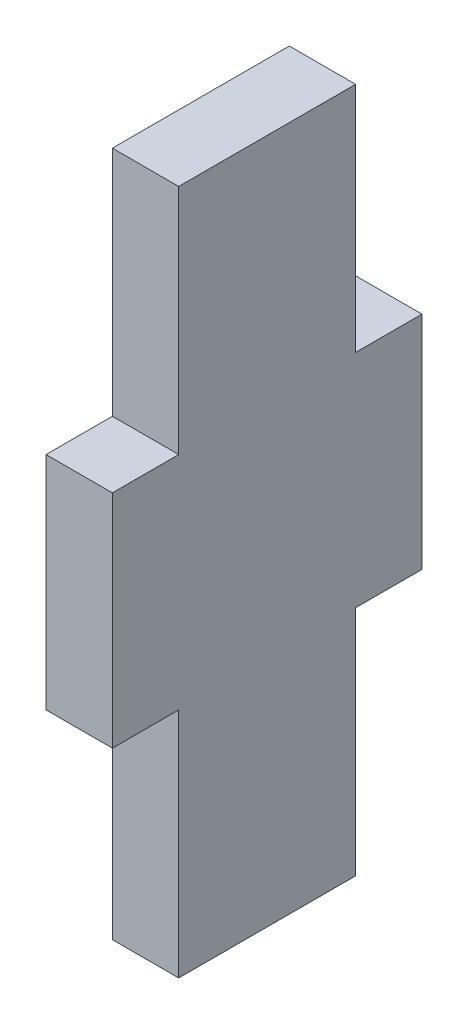
ISO-10303-21;
HEADER;
FILE_DESCRIPTION(('STEP AP214'),'2;1');
FILE_NAME('part.step','',(''),(''),'','','');
FILE_SCHEMA(('AUTOMOTIVE_DESIGN { 1 0 10303 214 1 1 1 1 }'));
ENDSEC;
DATA;
#1=APPLICATION_CONTEXT('core data for automotive mechanical design processes');
#2=APPLICATION_PROTOCOL_DEFINITION('international standard','automotive_design',2000,#1);
#3=PRODUCT_CONTEXT('',#1,'mechanical');
#4=PRODUCT('Part','Part','',(#3));
#5=PRODUCT_RELATED_PRODUCT_CATEGORY('part','',(#4));
#6=PRODUCT_DEFINITION_FORMATION('','',#4);
#7=PRODUCT_DEFINITION_CONTEXT('part definition',#1,'design');
#8=PRODUCT_DEFINITION('design','',#6,#7);
#9=PRODUCT_DEFINITION_SHAPE('','',#8);
#10=(LENGTH_UNIT() NAMED_UNIT(*) SI_UNIT(.MILLI.,.METRE.));
#11=(NAMED_UNIT(*) PLANE_ANGLE_UNIT() SI_UNIT($,.RADIAN.));
#12=(NAMED_UNIT(*) SI_UNIT($,.STERADIAN.) SOLID_ANGLE_UNIT());
#13=UNCERTAINTY_MEASURE_WITH_UNIT(LENGTH_MEASURE(1.E-05),#10,'distance_accuracy_value','');
#14=(GEOMETRIC_REPRESENTATION_CONTEXT(3) GLOBAL_UNCERTAINTY_ASSIGNED_CONTEXT((#13)) GLOBAL_UNIT_ASSIGNED_CONTEXT((#10,
#11,#12)) REPRESENTATION_CONTEXT('',''));
#15=CARTESIAN_POINT('',(0.,0.,0.));
#16=DIRECTION('',(0.,0.,1.));
#17=DIRECTION('',(1.,0.,0.));
#18=AXIS2_PLACEMENT_3D('',#15,#16,#17);
#19=CARTESIAN_POINT('',(-103.003078089394,28.2958445793191,184.000049999986));
#20=DIRECTION('',(0.,0.,1.));
#21=DIRECTION('',(1.,0.,0.));
#22=AXIS2_PLACEMENT_3D('',#19,#20,#21);
#23=PLANE('',#22);
#24=DIRECTION('',(1.,0.,0.));
#25=VECTOR('',#24,1.);
#26=CARTESIAN_POINT('',(-103.003078089394,7.29584457931905,184.000049999986));
#27=LINE('',#26,#25);
#28=CARTESIAN_POINT('',(-103.003078089394,7.29584457931905,184.000049999986));
#29=VERTEX_POINT('',#28);
#30=CARTESIAN_POINT('',(-97.0030780893944,7.29584457931905,184.000049999986));
#31=VERTEX_POINT('',#30);
#32=EDGE_CURVE('E133',#29,#31,#27,.T.);
#33=ORIENTED_EDGE('',*,*,#32,.F.);
#34=DIRECTION('',(0.,-1.,0.));
#35=VECTOR('',#34,1.);
#36=CARTESIAN_POINT('',(-103.003078089394,28.2958445793191,184.000049999986));
#37=LINE('',#36,#35);
#38=CARTESIAN_POINT('',(-103.003078089394,28.2958445793191,184.000049999986));
#39=VERTEX_POINT('',#38);
#40=EDGE_CURVE('E145',#39,#29,#37,.T.);
#41=ORIENTED_EDGE('',*,*,#40,.F.);
#42=DIRECTION('',(1.,0.,0.));
#43=VECTOR('',#42,1.);
#44=CARTESIAN_POINT('',(-103.003078089394,28.2958445793191,184.000049999986));
#45=LINE('',#44,#43);
#46=CARTESIAN_POINT('',(-97.0030780893944,28.2958445793191,184.000049999986));
#47=VERTEX_POINT('',#46);
#48=EDGE_CURVE('E44',#39,#47,#45,.T.);
#49=ORIENTED_EDGE('',*,*,#48,.T.);
#50=DIRECTION('',(0.,-1.,0.));
#51=VECTOR('',#50,1.);
#52=CARTESIAN_POINT('',(-97.0030780893944,28.2958445793191,184.000049999986));
#53=LINE('',#52,#51);
#54=EDGE_CURVE('E147',#47,#31,#53,.T.);
#55=ORIENTED_EDGE('',*,*,#54,.T.);
#56=EDGE_LOOP('',(#33,#41,#49,#55));
#57=FACE_BOUND('',#56,.T.);
#58=ADVANCED_FACE('F35',(#57),#23,.F.);
#59=CARTESIAN_POINT('',(-103.003078089394,22.2958445793191,200.000049999986));
#60=DIRECTION('',(0.,0.,-1.));
#61=DIRECTION('',(-1.,0.,0.));
#62=AXIS2_PLACEMENT_3D('',#59,#60,#61);
#63=PLANE('',#62);
#64=DIRECTION('',(1.,0.,0.));
#65=VECTOR('',#64,1.);
#66=CARTESIAN_POINT('',(-103.003078089394,-12.7041554206809,200.000049999986));
#67=LINE('',#66,#65);
#68=CARTESIAN_POINT('',(-103.003078089394,-12.7041554206809,200.000049999986));
#69=VERTEX_POINT('',#68);
#70=CARTESIAN_POINT('',(-97.0030780893944,-12.7041554206809,200.000049999986));
#71=VERTEX_POINT('',#70);
#72=EDGE_CURVE('E190',#69,#71,#67,.T.);
#73=ORIENTED_EDGE('',*,*,#72,.F.);
#74=DIRECTION('',(0.,1.,0.));
#75=VECTOR('',#74,1.);
#76=CARTESIAN_POINT('',(-103.003078089394,22.2958445793191,200.000049999986));
#77=LINE('',#76,#75);
#78=CARTESIAN_POINT('',(-103.003078089394,-33.7041554206809,200.000049999986));
#79=VERTEX_POINT('',#78);
#80=EDGE_CURVE('E204',#79,#69,#77,.T.);
#81=ORIENTED_EDGE('',*,*,#80,.F.);
#82=DIRECTION('',(1.,0.,0.));
#83=VECTOR('',#82,1.);
#84=CARTESIAN_POINT('',(-103.003078089394,-33.7041554206809,200.000049999986));
#85=LINE('',#84,#83);
#86=CARTESIAN_POINT('',(-97.0030780893944,-33.7041554206809,200.000049999986));
#87=VERTEX_POINT('',#86);
#88=EDGE_CURVE('E189',#79,#87,#85,.T.);
#89=ORIENTED_EDGE('',*,*,#88,.T.);
#90=DIRECTION('',(0.,1.,0.));
#91=VECTOR('',#90,1.);
#92=CARTESIAN_POINT('',(-97.0030780893944,22.2958445793191,200.000049999986));
#93=LINE('',#92,#91);
#94=EDGE_CURVE('E178',#87,#71,#93,.T.);
#95=ORIENTED_EDGE('',*,*,#94,.T.);
#96=EDGE_LOOP('',(#73,#81,#89,#95));
#97=FACE_BOUND('',#96,.T.);
#98=ADVANCED_FACE('F272',(#97),#63,.F.);
#99=CARTESIAN_POINT('',(-103.003078089394,7.29584457931905,200.000049999986));
#100=VERTEX_POINT('',#99);
#101=CARTESIAN_POINT('',(-103.003078089394,28.2958445793191,200.000049999986));
#102=VERTEX_POINT('',#101);
#103=EDGE_CURVE('E183',#100,#102,#77,.T.);
#104=ORIENTED_EDGE('',*,*,#103,.F.);
#105=DIRECTION('',(1.,0.,0.));
#106=VECTOR('',#105,1.);
#107=CARTESIAN_POINT('',(-103.003078089394,7.29584457931905,200.000049999986));
#108=LINE('',#107,#106);
#109=CARTESIAN_POINT('',(-97.0030780893944,7.29584457931905,200.000049999986));
#110=VERTEX_POINT('',#109);
#111=EDGE_CURVE('E215',#100,#110,#108,.T.);
#112=ORIENTED_EDGE('',*,*,#111,.T.);
#113=CARTESIAN_POINT('',(-97.0030780893944,28.2958445793191,200.000049999986));
#114=VERTEX_POINT('',#113);
#115=EDGE_CURVE('E175',#110,#114,#93,.T.);
#116=ORIENTED_EDGE('',*,*,#115,.T.);
#117=DIRECTION('',(1.,0.,0.));
#118=VECTOR('',#117,1.);
#119=CARTESIAN_POINT('',(-103.003078089394,28.2958445793191,200.000049999986));
#120=LINE('',#119,#118);
#121=EDGE_CURVE('E11',#102,#114,#120,.T.);
#122=ORIENTED_EDGE('',*,*,#121,.F.);
#123=EDGE_LOOP('',(#104,#112,#116,#122));
#124=FACE_BOUND('',#123,.T.);
#125=ADVANCED_FACE('F37',(#124),#63,.F.);
#126=CARTESIAN_POINT('',(-103.003078089394,28.2958445793191,200.000049999986));
#127=DIRECTION('',(0.,-1.,0.));
#128=DIRECTION('',(0.,0.,-1.));
#129=AXIS2_PLACEMENT_3D('',#126,#127,#128);
#130=PLANE('',#129);
#131=DIRECTION('',(0.,0.,-1.));
#132=VECTOR('',#131,1.);
#133=CARTESIAN_POINT('',(-97.0030780893944,28.2958445793191,200.000049999986));
#134=LINE('',#133,#132);
#135=EDGE_CURVE('E172',#114,#47,#134,.T.);
#136=ORIENTED_EDGE('',*,*,#135,.T.);
#137=ORIENTED_EDGE('',*,*,#48,.F.);
#138=DIRECTION('',(0.,0.,-1.));
#139=VECTOR('',#138,1.);
#140=CARTESIAN_POINT('',(-103.003078089394,28.2958445793191,200.000049999986));
#141=LINE('',#140,#139);
#142=EDGE_CURVE('E153',#102,#39,#141,.T.);
#143=ORIENTED_EDGE('',*,*,#142,.F.);
#144=ORIENTED_EDGE('',*,*,#121,.T.);
#145=EDGE_LOOP('',(#136,#137,#143,#144));
#146=FACE_BOUND('',#145,.T.);
#147=ADVANCED_FACE('F212',(#146),#130,.F.);
#148=CARTESIAN_POINT('',(-103.003078089394,-12.7041554206809,184.000049999986));
#149=VERTEX_POINT('',#148);
#150=CARTESIAN_POINT('',(-103.003078089394,-33.7041554206809,184.000049999986));
#151=VERTEX_POINT('',#150);
#152=EDGE_CURVE('E155',#149,#151,#37,.T.);
#153=ORIENTED_EDGE('',*,*,#152,.F.);
#154=DIRECTION('',(1.,0.,0.));
#155=VECTOR('',#154,1.);
#156=CARTESIAN_POINT('',(-103.003078089394,-12.7041554206809,184.000049999986));
#157=LINE('',#156,#155);
#158=CARTESIAN_POINT('',(-97.0030780893944,-12.7041554206809,184.000049999986));
#159=VERTEX_POINT('',#158);
#160=EDGE_CURVE('E226',#149,#159,#157,.T.);
#161=ORIENTED_EDGE('',*,*,#160,.T.);
#162=CARTESIAN_POINT('',(-97.0030780893944,-33.7041554206809,184.000049999986));
#163=VERTEX_POINT('',#162);
#164=EDGE_CURVE('E161',#159,#163,#53,.T.);
#165=ORIENTED_EDGE('',*,*,#164,.T.);
#166=DIRECTION('',(1.,0.,0.));
#167=VECTOR('',#166,1.);
#168=CARTESIAN_POINT('',(-103.003078089394,-33.7041554206809,184.000049999986));
#169=LINE('',#168,#167);
#170=EDGE_CURVE('E224',#151,#163,#169,.T.);
#171=ORIENTED_EDGE('',*,*,#170,.F.);
#172=EDGE_LOOP('',(#153,#161,#165,#171));
#173=FACE_BOUND('',#172,.T.);
#174=ADVANCED_FACE('F223',(#173),#23,.F.);
#175=CARTESIAN_POINT('',(-103.003078089394,0.,0.));
#176=DIRECTION('',(-1.,0.,0.));
#177=DIRECTION('',(0.,0.,1.));
#178=AXIS2_PLACEMENT_3D('',#175,#176,#177);
#179=PLANE('',#178);
#180=ORIENTED_EDGE('',*,*,#80,.T.);
#181=DIRECTION('',(0.,0.,1.));
#182=VECTOR('',#181,1.);
#183=CARTESIAN_POINT('',(-103.003078089394,-12.7041554206809,200.000049999986));
#184=LINE('',#183,#182);
#185=CARTESIAN_POINT('',(-103.003078089394,-12.7041554206809,206.000049999986));
#186=VERTEX_POINT('',#185);
#187=EDGE_CURVE('E242',#69,#186,#184,.T.);
#188=ORIENTED_EDGE('',*,*,#187,.T.);
#189=DIRECTION('',(0.,1.,0.));
#190=VECTOR('',#189,1.);
#191=CARTESIAN_POINT('',(-103.003078089394,-12.7041554206809,206.000049999986));
#192=LINE('',#191,#190);
#193=CARTESIAN_POINT('',(-103.003078089394,7.29584457931905,206.000049999986));
#194=VERTEX_POINT('',#193);
#195=EDGE_CURVE('E240',#186,#194,#192,.T.);
#196=ORIENTED_EDGE('',*,*,#195,.T.);
#197=DIRECTION('',(0.,0.,-1.));
#198=VECTOR('',#197,1.);
#199=CARTESIAN_POINT('',(-103.003078089394,7.29584457931905,206.000049999986));
#200=LINE('',#199,#198);
#201=EDGE_CURVE('E208',#194,#100,#200,.T.);
#202=ORIENTED_EDGE('',*,*,#201,.T.);
#203=ORIENTED_EDGE('',*,*,#103,.T.);
#204=ORIENTED_EDGE('',*,*,#142,.T.);
#205=ORIENTED_EDGE('',*,*,#40,.T.);
#206=DIRECTION('',(0.,0.,-1.));
#207=VECTOR('',#206,1.);
#208=CARTESIAN_POINT('',(-103.003078089394,7.29584457931905,178.000049999986));
#209=LINE('',#208,#207);
#210=CARTESIAN_POINT('',(-103.003078089394,7.29584457931905,178.000049999986));
#211=VERTEX_POINT('',#210);
#212=EDGE_CURVE('E130',#29,#211,#209,.T.);
#213=ORIENTED_EDGE('',*,*,#212,.T.);
#214=DIRECTION('',(0.,-1.,0.));
#215=VECTOR('',#214,1.);
#216=CARTESIAN_POINT('',(-103.003078089394,-12.7041554206809,178.000049999986));
#217=LINE('',#216,#215);
#218=CARTESIAN_POINT('',(-103.003078089394,-12.7041554206809,178.000049999986));
#219=VERTEX_POINT('',#218);
#220=EDGE_CURVE('E140',#211,#219,#217,.T.);
#221=ORIENTED_EDGE('',*,*,#220,.T.);
#222=DIRECTION('',(0.,0.,1.));
#223=VECTOR('',#222,1.);
#224=CARTESIAN_POINT('',(-103.003078089394,-12.7041554206809,184.000049999986));
#225=LINE('',#224,#223);
#226=EDGE_CURVE('E440',#219,#149,#225,.T.);
#227=ORIENTED_EDGE('',*,*,#226,.T.);
#228=ORIENTED_EDGE('',*,*,#152,.T.);
#229=DIRECTION('',(0.,0.,1.));
#230=VECTOR('',#229,1.);
#231=CARTESIAN_POINT('',(-103.003078089394,-33.7041554206809,184.000049999986));
#232=LINE('',#231,#230);
#233=EDGE_CURVE('E232',#151,#79,#232,.T.);
#234=ORIENTED_EDGE('',*,*,#233,.T.);
#235=EDGE_LOOP('',(#180,#188,#196,#202,#203,#204,#205,#213,#221,#227,#228,#234));
#236=FACE_BOUND('',#235,.T.);
#237=ADVANCED_FACE('F151',(#236),#179,.T.);
#238=CARTESIAN_POINT('',(-97.0030780893944,0.,0.));
#239=DIRECTION('',(-1.,0.,0.));
#240=DIRECTION('',(0.,0.,1.));
#241=AXIS2_PLACEMENT_3D('',#238,#239,#240);
#242=PLANE('',#241);
#243=ORIENTED_EDGE('',*,*,#94,.F.);
#244=DIRECTION('',(0.,0.,1.));
#245=VECTOR('',#244,1.);
#246=CARTESIAN_POINT('',(-97.0030780893944,-33.7041554206809,184.000049999986));
#247=LINE('',#246,#245);
#248=EDGE_CURVE('E148',#163,#87,#247,.T.);
#249=ORIENTED_EDGE('',*,*,#248,.F.);
#250=ORIENTED_EDGE('',*,*,#164,.F.);
#251=DIRECTION('',(0.,0.,1.));
#252=VECTOR('',#251,1.);
#253=CARTESIAN_POINT('',(-97.0030780893944,-12.7041554206809,184.000049999986));
#254=LINE('',#253,#252);
#255=CARTESIAN_POINT('',(-97.0030780893944,-12.7041554206809,178.000049999986));
#256=VERTEX_POINT('',#255);
#257=EDGE_CURVE('E52',#256,#159,#254,.T.);
#258=ORIENTED_EDGE('',*,*,#257,.F.);
#259=DIRECTION('',(0.,-1.,0.));
#260=VECTOR('',#259,1.);
#261=CARTESIAN_POINT('',(-97.0030780893944,-12.7041554206809,178.000049999986));
#262=LINE('',#261,#260);
#263=CARTESIAN_POINT('',(-97.0030780893944,7.29584457931905,178.000049999986));
#264=VERTEX_POINT('',#263);
#265=EDGE_CURVE('E435',#264,#256,#262,.T.);
#266=ORIENTED_EDGE('',*,*,#265,.F.);
#267=DIRECTION('',(0.,0.,-1.));
#268=VECTOR('',#267,1.);
#269=CARTESIAN_POINT('',(-97.0030780893944,7.29584457931905,178.000049999986));
#270=LINE('',#269,#268);
#271=EDGE_CURVE('E438',#31,#264,#270,.T.);
#272=ORIENTED_EDGE('',*,*,#271,.F.);
#273=ORIENTED_EDGE('',*,*,#54,.F.);
#274=ORIENTED_EDGE('',*,*,#135,.F.);
#275=ORIENTED_EDGE('',*,*,#115,.F.);
#276=DIRECTION('',(0.,0.,-1.));
#277=VECTOR('',#276,1.);
#278=CARTESIAN_POINT('',(-97.0030780893944,7.29584457931905,206.000049999986));
#279=LINE('',#278,#277);
#280=CARTESIAN_POINT('',(-97.0030780893944,7.29584457931905,206.000049999986));
#281=VERTEX_POINT('',#280);
#282=EDGE_CURVE('E60',#281,#110,#279,.T.);
#283=ORIENTED_EDGE('',*,*,#282,.F.);
#284=DIRECTION('',(0.,1.,0.));
#285=VECTOR('',#284,1.);
#286=CARTESIAN_POINT('',(-97.0030780893944,-12.7041554206809,206.000049999986));
#287=LINE('',#286,#285);
#288=CARTESIAN_POINT('',(-97.0030780893944,-12.7041554206809,206.000049999986));
#289=VERTEX_POINT('',#288);
#290=EDGE_CURVE('E188',#289,#281,#287,.T.);
#291=ORIENTED_EDGE('',*,*,#290,.F.);
#292=DIRECTION('',(0.,0.,1.));
#293=VECTOR('',#292,1.);
#294=CARTESIAN_POINT('',(-97.0030780893944,-12.7041554206809,200.000049999986));
#295=LINE('',#294,#293);
#296=EDGE_CURVE('E186',#71,#289,#295,.T.);
#297=ORIENTED_EDGE('',*,*,#296,.F.);
#298=EDGE_LOOP('',(#243,#249,#250,#258,#266,#272,#273,#274,#275,#283,#291,#297));
#299=FACE_BOUND('',#298,.T.);
#300=ADVANCED_FACE('F217',(#299),#242,.F.);
#301=CARTESIAN_POINT('',(-103.003078089394,-12.7041554206809,200.000049999986));
#302=DIRECTION('',(0.,1.,0.));
#303=DIRECTION('',(0.,0.,1.));
#304=AXIS2_PLACEMENT_3D('',#301,#302,#303);
#305=PLANE('',#304);
#306=ORIENTED_EDGE('',*,*,#296,.T.);
#307=DIRECTION('',(1.,0.,0.));
#308=VECTOR('',#307,1.);
#309=CARTESIAN_POINT('',(-103.003078089394,-12.7041554206809,206.000049999986));
#310=LINE('',#309,#308);
#311=EDGE_CURVE('E194',#186,#289,#310,.T.);
#312=ORIENTED_EDGE('',*,*,#311,.F.);
#313=ORIENTED_EDGE('',*,*,#187,.F.);
#314=ORIENTED_EDGE('',*,*,#72,.T.);
#315=EDGE_LOOP('',(#306,#312,#313,#314));
#316=FACE_BOUND('',#315,.T.);
#317=ADVANCED_FACE('F258',(#316),#305,.F.);
#318=CARTESIAN_POINT('',(-103.003078089394,-12.7041554206809,206.000049999986));
#319=DIRECTION('',(0.,0.,-1.));
#320=DIRECTION('',(-1.,0.,0.));
#321=AXIS2_PLACEMENT_3D('',#318,#319,#320);
#322=PLANE('',#321);
#323=ORIENTED_EDGE('',*,*,#290,.T.);
#324=DIRECTION('',(1.,0.,0.));
#325=VECTOR('',#324,1.);
#326=CARTESIAN_POINT('',(-103.003078089394,7.29584457931905,206.000049999986));
#327=LINE('',#326,#325);
#328=EDGE_CURVE('E245',#194,#281,#327,.T.);
#329=ORIENTED_EDGE('',*,*,#328,.F.);
#330=ORIENTED_EDGE('',*,*,#195,.F.);
#331=ORIENTED_EDGE('',*,*,#311,.T.);
#332=EDGE_LOOP('',(#323,#329,#330,#331));
#333=FACE_BOUND('',#332,.T.);
#334=ADVANCED_FACE('F261',(#333),#322,.F.);
#335=CARTESIAN_POINT('',(-103.003078089394,7.29584457931905,206.000049999986));
#336=DIRECTION('',(0.,-1.,0.));
#337=DIRECTION('',(0.,0.,-1.));
#338=AXIS2_PLACEMENT_3D('',#335,#336,#337);
#339=PLANE('',#338);
#340=ORIENTED_EDGE('',*,*,#282,.T.);
#341=ORIENTED_EDGE('',*,*,#111,.F.);
#342=ORIENTED_EDGE('',*,*,#201,.F.);
#343=ORIENTED_EDGE('',*,*,#328,.T.);
#344=EDGE_LOOP('',(#340,#341,#342,#343));
#345=FACE_BOUND('',#344,.T.);
#346=ADVANCED_FACE('F262',(#345),#339,.F.);
#347=CARTESIAN_POINT('',(-103.003078089394,-33.7041554206809,184.000049999986));
#348=DIRECTION('',(0.,1.,0.));
#349=DIRECTION('',(0.,0.,1.));
#350=AXIS2_PLACEMENT_3D('',#347,#348,#349);
#351=PLANE('',#350);
#352=ORIENTED_EDGE('',*,*,#248,.T.);
#353=ORIENTED_EDGE('',*,*,#88,.F.);
#354=ORIENTED_EDGE('',*,*,#233,.F.);
#355=ORIENTED_EDGE('',*,*,#170,.T.);
#356=EDGE_LOOP('',(#352,#353,#354,#355));
#357=FACE_BOUND('',#356,.T.);
#358=ADVANCED_FACE('F230',(#357),#351,.F.);
#359=CARTESIAN_POINT('',(-103.003078089394,7.29584457931905,178.000049999986));
#360=DIRECTION('',(0.,-1.,0.));
#361=DIRECTION('',(0.,0.,-1.));
#362=AXIS2_PLACEMENT_3D('',#359,#360,#361);
#363=PLANE('',#362);
#364=ORIENTED_EDGE('',*,*,#271,.T.);
#365=DIRECTION('',(1.,0.,0.));
#366=VECTOR('',#365,1.);
#367=CARTESIAN_POINT('',(-103.003078089394,7.29584457931905,178.000049999986));
#368=LINE('',#367,#366);
#369=EDGE_CURVE('E136',#211,#264,#368,.T.);
#370=ORIENTED_EDGE('',*,*,#369,.F.);
#371=ORIENTED_EDGE('',*,*,#212,.F.);
#372=ORIENTED_EDGE('',*,*,#32,.T.);
#373=EDGE_LOOP('',(#364,#370,#371,#372));
#374=FACE_BOUND('',#373,.T.);
#375=ADVANCED_FACE('F132',(#374),#363,.F.);
#376=CARTESIAN_POINT('',(-103.003078089394,-12.7041554206809,178.000049999986));
#377=DIRECTION('',(0.,0.,1.));
#378=DIRECTION('',(1.,0.,0.));
#379=AXIS2_PLACEMENT_3D('',#376,#377,#378);
#380=PLANE('',#379);
#381=ORIENTED_EDGE('',*,*,#265,.T.);
#382=DIRECTION('',(1.,0.,0.));
#383=VECTOR('',#382,1.);
#384=CARTESIAN_POINT('',(-103.003078089394,-12.7041554206809,178.000049999986));
#385=LINE('',#384,#383);
#386=EDGE_CURVE('E436',#219,#256,#385,.T.);
#387=ORIENTED_EDGE('',*,*,#386,.F.);
#388=ORIENTED_EDGE('',*,*,#220,.F.);
#389=ORIENTED_EDGE('',*,*,#369,.T.);
#390=EDGE_LOOP('',(#381,#387,#388,#389));
#391=FACE_BOUND('',#390,.T.);
#392=ADVANCED_FACE('F367',(#391),#380,.F.);
#393=CARTESIAN_POINT('',(-103.003078089394,-12.7041554206809,184.000049999986));
#394=DIRECTION('',(0.,1.,0.));
#395=DIRECTION('',(0.,0.,1.));
#396=AXIS2_PLACEMENT_3D('',#393,#394,#395);
#397=PLANE('',#396);
#398=ORIENTED_EDGE('',*,*,#257,.T.);
#399=ORIENTED_EDGE('',*,*,#160,.F.);
#400=ORIENTED_EDGE('',*,*,#226,.F.);
#401=ORIENTED_EDGE('',*,*,#386,.T.);
#402=EDGE_LOOP('',(#398,#399,#400,#401));
#403=FACE_BOUND('',#402,.T.);
#404=ADVANCED_FACE('F376',(#403),#397,.F.);
#405=CLOSED_SHELL('',(#58,#98,#125,#147,#174,#237,#300,#317,#334,#346,#358,#375,#392,#404));
#406=MANIFOLD_SOLID_BREP('B2',#405);
#407=ADVANCED_BREP_SHAPE_REPRESENTATION('',(#18,#406),#14);
#408=SHAPE_DEFINITION_REPRESENTATION(#9,#407);
ENDSEC;
END-ISO-10303-21;
